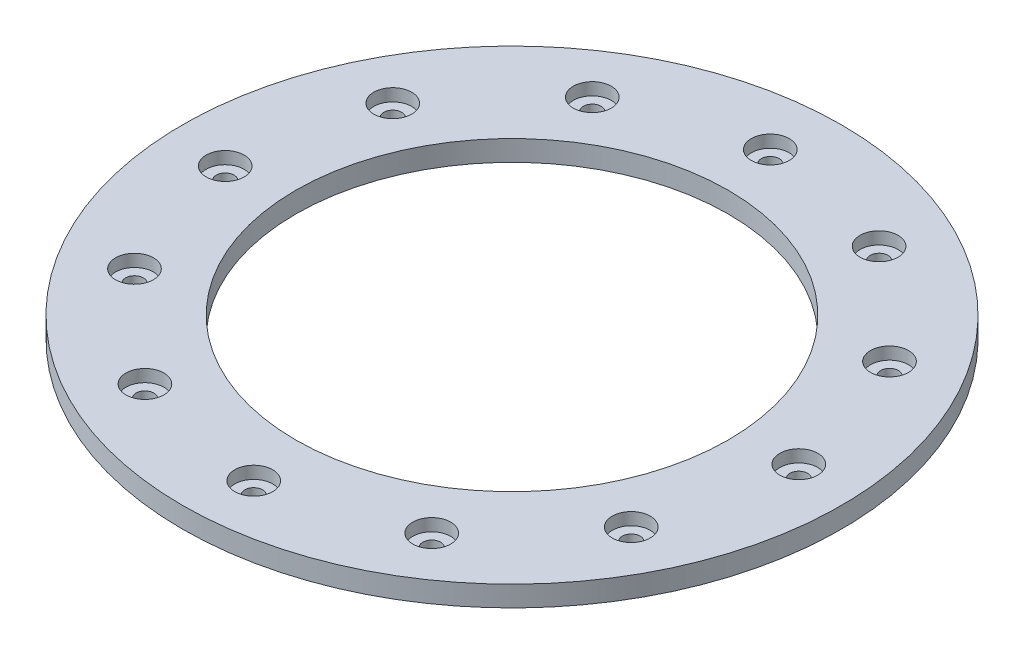
ISO-10303-21;
HEADER;
FILE_DESCRIPTION(('STEP AP214'),'2;1');
FILE_NAME('part.step','',(''),(''),'','','');
FILE_SCHEMA(('AUTOMOTIVE_DESIGN { 1 0 10303 214 1 1 1 1 }'));
ENDSEC;
DATA;
#1=APPLICATION_CONTEXT('core data for automotive mechanical design processes');
#2=APPLICATION_PROTOCOL_DEFINITION('international standard','automotive_design',2000,#1);
#3=PRODUCT_CONTEXT('',#1,'mechanical');
#4=PRODUCT('Part','Part','',(#3));
#5=PRODUCT_RELATED_PRODUCT_CATEGORY('part','',(#4));
#6=PRODUCT_DEFINITION_FORMATION('','',#4);
#7=PRODUCT_DEFINITION_CONTEXT('part definition',#1,'design');
#8=PRODUCT_DEFINITION('design','',#6,#7);
#9=PRODUCT_DEFINITION_SHAPE('','',#8);
#10=(LENGTH_UNIT() NAMED_UNIT(*) SI_UNIT(.MILLI.,.METRE.));
#11=(NAMED_UNIT(*) PLANE_ANGLE_UNIT() SI_UNIT($,.RADIAN.));
#12=(NAMED_UNIT(*) SI_UNIT($,.STERADIAN.) SOLID_ANGLE_UNIT());
#13=UNCERTAINTY_MEASURE_WITH_UNIT(LENGTH_MEASURE(1.E-05),#10,'distance_accuracy_value','');
#14=(GEOMETRIC_REPRESENTATION_CONTEXT(3) GLOBAL_UNCERTAINTY_ASSIGNED_CONTEXT((#13)) GLOBAL_UNIT_ASSIGNED_CONTEXT((#10,
#11,#12)) REPRESENTATION_CONTEXT('',''));
#15=CARTESIAN_POINT('',(0.,0.,0.));
#16=DIRECTION('',(0.,0.,1.));
#17=DIRECTION('',(1.,0.,0.));
#18=AXIS2_PLACEMENT_3D('',#15,#16,#17);
#19=CARTESIAN_POINT('',(0.,6.35,0.));
#20=DIRECTION('',(0.,1.,0.));
#21=DIRECTION('',(0.,0.,1.));
#22=AXIS2_PLACEMENT_3D('',#19,#20,#21);
#23=PLANE('',#22);
#24=CARTESIAN_POINT('',(-45.8207224881937,6.35,-70.5661412924777));
#25=DIRECTION('',(0.,1.,0.));
#26=DIRECTION('',(0.,0.,1.));
#27=AXIS2_PLACEMENT_3D('',#24,#25,#26);
#28=CIRCLE('',#27,5.855);
#29=CARTESIAN_POINT('',(-45.8207224881937,6.35,-64.7111412924777));
#30=VERTEX_POINT('',#29);
#31=EDGE_CURVE('E189',#30,#30,#28,.T.);
#32=ORIENTED_EDGE('',*,*,#31,.F.);
#33=EDGE_LOOP('',(#32));
#34=FACE_BOUND('',#33,.T.);
#35=CARTESIAN_POINT('',(-4.39883904829373,6.35,-84.0224322504247));
#36=DIRECTION('',(0.,1.,0.));
#37=DIRECTION('',(0.,0.,1.));
#38=AXIS2_PLACEMENT_3D('',#35,#36,#37);
#39=CIRCLE('',#38,5.855);
#40=CARTESIAN_POINT('',(-4.39883904829373,6.35,-78.1674322504247));
#41=VERTEX_POINT('',#40);
#42=EDGE_CURVE('E177',#41,#41,#39,.T.);
#43=ORIENTED_EDGE('',*,*,#42,.F.);
#44=EDGE_LOOP('',(#43));
#45=FACE_BOUND('',#44,.T.);
#46=CARTESIAN_POINT('',(38.2017097622311,6.35,-74.9649803407715));
#47=DIRECTION('',(0.,1.,0.));
#48=DIRECTION('',(0.,0.,1.));
#49=AXIS2_PLACEMENT_3D('',#46,#47,#48);
#50=CIRCLE('',#49,5.85499999999999);
#51=CARTESIAN_POINT('',(38.2017097622311,6.35,-69.1099803407715));
#52=VERTEX_POINT('',#51);
#53=EDGE_CURVE('E165',#52,#52,#50,.T.);
#54=ORIENTED_EDGE('',*,*,#53,.F.);
#55=EDGE_LOOP('',(#54));
#56=FACE_BOUND('',#55,.T.);
#57=CARTESIAN_POINT('',(70.5661412924779,6.35,-45.8207224881935));
#58=DIRECTION('',(0.,1.,0.));
#59=DIRECTION('',(0.,0.,1.));
#60=AXIS2_PLACEMENT_3D('',#57,#58,#59);
#61=CIRCLE('',#60,5.855);
#62=CARTESIAN_POINT('',(70.5661412924779,6.35,-39.9657224881935));
#63=VERTEX_POINT('',#62);
#64=EDGE_CURVE('E153',#63,#63,#61,.T.);
#65=ORIENTED_EDGE('',*,*,#64,.F.);
#66=EDGE_LOOP('',(#65));
#67=FACE_BOUND('',#66,.T.);
#68=CARTESIAN_POINT('',(84.0224322504247,6.35,-4.39883904829343));
#69=DIRECTION('',(0.,1.,0.));
#70=DIRECTION('',(0.,0.,1.));
#71=AXIS2_PLACEMENT_3D('',#68,#69,#70);
#72=CIRCLE('',#71,5.855);
#73=CARTESIAN_POINT('',(84.0224322504247,6.35,1.45616095170657));
#74=VERTEX_POINT('',#73);
#75=EDGE_CURVE('E141',#74,#74,#72,.T.);
#76=ORIENTED_EDGE('',*,*,#75,.F.);
#77=EDGE_LOOP('',(#76));
#78=FACE_BOUND('',#77,.T.);
#79=CARTESIAN_POINT('',(74.9649803407711,6.35,38.2017097622319));
#80=DIRECTION('',(0.,1.,0.));
#81=DIRECTION('',(0.,0.,1.));
#82=AXIS2_PLACEMENT_3D('',#79,#80,#81);
#83=CIRCLE('',#82,5.855);
#84=CARTESIAN_POINT('',(74.9649803407711,6.35,44.0567097622319));
#85=VERTEX_POINT('',#84);
#86=EDGE_CURVE('E129',#85,#85,#83,.T.);
#87=ORIENTED_EDGE('',*,*,#86,.F.);
#88=EDGE_LOOP('',(#87));
#89=FACE_BOUND('',#88,.T.);
#90=CARTESIAN_POINT('',(45.8207224881932,6.35,70.5661412924781));
#91=DIRECTION('',(0.,1.,0.));
#92=DIRECTION('',(0.,0.,1.));
#93=AXIS2_PLACEMENT_3D('',#90,#91,#92);
#94=CIRCLE('',#93,5.85499999999999);
#95=CARTESIAN_POINT('',(45.8207224881932,6.35,76.4211412924781));
#96=VERTEX_POINT('',#95);
#97=EDGE_CURVE('E117',#96,#96,#94,.T.);
#98=ORIENTED_EDGE('',*,*,#97,.F.);
#99=EDGE_LOOP('',(#98));
#100=FACE_BOUND('',#99,.T.);
#101=CARTESIAN_POINT('',(4.39883904829314,6.35,84.0224322504247));
#102=DIRECTION('',(0.,1.,0.));
#103=DIRECTION('',(0.,0.,1.));
#104=AXIS2_PLACEMENT_3D('',#101,#102,#103);
#105=CIRCLE('',#104,5.855);
#106=CARTESIAN_POINT('',(4.39883904829314,6.35,89.8774322504247));
#107=VERTEX_POINT('',#106);
#108=EDGE_CURVE('E105',#107,#107,#105,.T.);
#109=ORIENTED_EDGE('',*,*,#108,.F.);
#110=EDGE_LOOP('',(#109));
#111=FACE_BOUND('',#110,.T.);
#112=CARTESIAN_POINT('',(-38.2017097622316,6.35,74.9649803407712));
#113=DIRECTION('',(0.,1.,0.));
#114=DIRECTION('',(0.,0.,1.));
#115=AXIS2_PLACEMENT_3D('',#112,#113,#114);
#116=CIRCLE('',#115,5.855);
#117=CARTESIAN_POINT('',(-38.2017097622316,6.35,80.8199803407712));
#118=VERTEX_POINT('',#117);
#119=EDGE_CURVE('E93',#118,#118,#116,.T.);
#120=ORIENTED_EDGE('',*,*,#119,.F.);
#121=EDGE_LOOP('',(#120));
#122=FACE_BOUND('',#121,.T.);
#123=CARTESIAN_POINT('',(-70.5661412924782,6.35,45.820722488193));
#124=DIRECTION('',(0.,1.,0.));
#125=DIRECTION('',(0.,0.,1.));
#126=AXIS2_PLACEMENT_3D('',#123,#124,#125);
#127=CIRCLE('',#126,5.855);
#128=CARTESIAN_POINT('',(-70.5661412924782,6.35,51.675722488193));
#129=VERTEX_POINT('',#128);
#130=EDGE_CURVE('E81',#129,#129,#127,.T.);
#131=ORIENTED_EDGE('',*,*,#130,.F.);
#132=EDGE_LOOP('',(#131));
#133=FACE_BOUND('',#132,.T.);
#134=CARTESIAN_POINT('',(-84.0224322504247,6.35,4.39883904829285));
#135=DIRECTION('',(0.,1.,0.));
#136=DIRECTION('',(0.,0.,1.));
#137=AXIS2_PLACEMENT_3D('',#134,#135,#136);
#138=CIRCLE('',#137,5.855);
#139=CARTESIAN_POINT('',(-84.0224322504247,6.35,10.2538390482928));
#140=VERTEX_POINT('',#139);
#141=EDGE_CURVE('E69',#140,#140,#138,.T.);
#142=ORIENTED_EDGE('',*,*,#141,.F.);
#143=EDGE_LOOP('',(#142));
#144=FACE_BOUND('',#143,.T.);
#145=CARTESIAN_POINT('',(-74.9649803407711,6.35,-38.2017097622319));
#146=DIRECTION('',(0.,1.,0.));
#147=DIRECTION('',(0.,0.,1.));
#148=AXIS2_PLACEMENT_3D('',#145,#146,#147);
#149=CIRCLE('',#148,5.855);
#150=CARTESIAN_POINT('',(-74.9649803407711,6.35,-32.3467097622319));
#151=VERTEX_POINT('',#150);
#152=EDGE_CURVE('E57',#151,#151,#149,.T.);
#153=ORIENTED_EDGE('',*,*,#152,.F.);
#154=EDGE_LOOP('',(#153));
#155=FACE_BOUND('',#154,.T.);
#156=CARTESIAN_POINT('',(0.,6.35,0.));
#157=DIRECTION('',(0.,1.,0.));
#158=DIRECTION('',(0.,0.,1.));
#159=AXIS2_PLACEMENT_3D('',#156,#157,#158);
#160=CIRCLE('',#159,66.675);
#161=CARTESIAN_POINT('',(0.,6.35,66.675));
#162=VERTEX_POINT('',#161);
#163=EDGE_CURVE('E41',#162,#162,#160,.T.);
#164=ORIENTED_EDGE('',*,*,#163,.F.);
#165=EDGE_LOOP('',(#164));
#166=FACE_BOUND('',#165,.T.);
#167=CARTESIAN_POINT('',(0.,6.35,0.));
#168=DIRECTION('',(0.,1.,0.));
#169=DIRECTION('',(0.,0.,1.));
#170=AXIS2_PLACEMENT_3D('',#167,#168,#169);
#171=CIRCLE('',#170,101.6);
#172=CARTESIAN_POINT('',(0.,6.35,101.6));
#173=VERTEX_POINT('',#172);
#174=EDGE_CURVE('E10',#173,#173,#171,.T.);
#175=ORIENTED_EDGE('',*,*,#174,.T.);
#176=EDGE_LOOP('',(#175));
#177=FACE_BOUND('',#176,.T.);
#178=ADVANCED_FACE('F30',(#34,#45,#56,#67,#78,#89,#100,#111,#122,#133,#144,#155,#166,#177),#23,.T.);
#179=CARTESIAN_POINT('',(0.,0.,0.));
#180=DIRECTION('',(0.,1.,0.));
#181=DIRECTION('',(0.,0.,1.));
#182=AXIS2_PLACEMENT_3D('',#179,#180,#181);
#183=PLANE('',#182);
#184=CARTESIAN_POINT('',(-45.8207224881937,0.,-70.5661412924777));
#185=DIRECTION('',(0.,1.,0.));
#186=DIRECTION('',(0.,0.,1.));
#187=AXIS2_PLACEMENT_3D('',#184,#185,#186);
#188=CIRCLE('',#187,2.75);
#189=CARTESIAN_POINT('',(-45.8207224881937,0.,-67.8161412924777));
#190=VERTEX_POINT('',#189);
#191=EDGE_CURVE('E180',#190,#190,#188,.T.);
#192=ORIENTED_EDGE('',*,*,#191,.T.);
#193=EDGE_LOOP('',(#192));
#194=FACE_BOUND('',#193,.T.);
#195=CARTESIAN_POINT('',(-4.39883904829373,0.,-84.0224322504247));
#196=DIRECTION('',(0.,1.,0.));
#197=DIRECTION('',(0.,0.,1.));
#198=AXIS2_PLACEMENT_3D('',#195,#196,#197);
#199=CIRCLE('',#198,2.75);
#200=CARTESIAN_POINT('',(-4.39883904829373,0.,-81.2724322504247));
#201=VERTEX_POINT('',#200);
#202=EDGE_CURVE('E168',#201,#201,#199,.T.);
#203=ORIENTED_EDGE('',*,*,#202,.T.);
#204=EDGE_LOOP('',(#203));
#205=FACE_BOUND('',#204,.T.);
#206=CARTESIAN_POINT('',(38.2017097622311,0.,-74.9649803407715));
#207=DIRECTION('',(0.,1.,0.));
#208=DIRECTION('',(0.,0.,1.));
#209=AXIS2_PLACEMENT_3D('',#206,#207,#208);
#210=CIRCLE('',#209,2.75);
#211=CARTESIAN_POINT('',(38.2017097622311,0.,-72.2149803407715));
#212=VERTEX_POINT('',#211);
#213=EDGE_CURVE('E156',#212,#212,#210,.T.);
#214=ORIENTED_EDGE('',*,*,#213,.T.);
#215=EDGE_LOOP('',(#214));
#216=FACE_BOUND('',#215,.T.);
#217=CARTESIAN_POINT('',(70.5661412924779,0.,-45.8207224881935));
#218=DIRECTION('',(0.,1.,0.));
#219=DIRECTION('',(0.,0.,1.));
#220=AXIS2_PLACEMENT_3D('',#217,#218,#219);
#221=CIRCLE('',#220,2.75);
#222=CARTESIAN_POINT('',(70.5661412924779,0.,-43.0707224881935));
#223=VERTEX_POINT('',#222);
#224=EDGE_CURVE('E144',#223,#223,#221,.T.);
#225=ORIENTED_EDGE('',*,*,#224,.T.);
#226=EDGE_LOOP('',(#225));
#227=FACE_BOUND('',#226,.T.);
#228=CARTESIAN_POINT('',(84.0224322504247,0.,-4.39883904829343));
#229=DIRECTION('',(0.,1.,0.));
#230=DIRECTION('',(0.,0.,1.));
#231=AXIS2_PLACEMENT_3D('',#228,#229,#230);
#232=CIRCLE('',#231,2.75);
#233=CARTESIAN_POINT('',(84.0224322504247,0.,-1.64883904829343));
#234=VERTEX_POINT('',#233);
#235=EDGE_CURVE('E132',#234,#234,#232,.T.);
#236=ORIENTED_EDGE('',*,*,#235,.T.);
#237=EDGE_LOOP('',(#236));
#238=FACE_BOUND('',#237,.T.);
#239=CARTESIAN_POINT('',(74.9649803407711,0.,38.2017097622319));
#240=DIRECTION('',(0.,1.,0.));
#241=DIRECTION('',(0.,0.,1.));
#242=AXIS2_PLACEMENT_3D('',#239,#240,#241);
#243=CIRCLE('',#242,2.75);
#244=CARTESIAN_POINT('',(74.9649803407711,0.,40.9517097622319));
#245=VERTEX_POINT('',#244);
#246=EDGE_CURVE('E120',#245,#245,#243,.T.);
#247=ORIENTED_EDGE('',*,*,#246,.T.);
#248=EDGE_LOOP('',(#247));
#249=FACE_BOUND('',#248,.T.);
#250=CARTESIAN_POINT('',(45.8207224881932,0.,70.5661412924781));
#251=DIRECTION('',(0.,1.,0.));
#252=DIRECTION('',(0.,0.,1.));
#253=AXIS2_PLACEMENT_3D('',#250,#251,#252);
#254=CIRCLE('',#253,2.75);
#255=CARTESIAN_POINT('',(45.8207224881932,0.,73.3161412924781));
#256=VERTEX_POINT('',#255);
#257=EDGE_CURVE('E108',#256,#256,#254,.T.);
#258=ORIENTED_EDGE('',*,*,#257,.T.);
#259=EDGE_LOOP('',(#258));
#260=FACE_BOUND('',#259,.T.);
#261=CARTESIAN_POINT('',(4.39883904829314,0.,84.0224322504247));
#262=DIRECTION('',(0.,1.,0.));
#263=DIRECTION('',(0.,0.,1.));
#264=AXIS2_PLACEMENT_3D('',#261,#262,#263);
#265=CIRCLE('',#264,2.75);
#266=CARTESIAN_POINT('',(4.39883904829314,0.,86.7724322504247));
#267=VERTEX_POINT('',#266);
#268=EDGE_CURVE('E96',#267,#267,#265,.T.);
#269=ORIENTED_EDGE('',*,*,#268,.T.);
#270=EDGE_LOOP('',(#269));
#271=FACE_BOUND('',#270,.T.);
#272=CARTESIAN_POINT('',(-38.2017097622316,0.,74.9649803407712));
#273=DIRECTION('',(0.,1.,0.));
#274=DIRECTION('',(0.,0.,1.));
#275=AXIS2_PLACEMENT_3D('',#272,#273,#274);
#276=CIRCLE('',#275,2.75);
#277=CARTESIAN_POINT('',(-38.2017097622316,0.,77.7149803407712));
#278=VERTEX_POINT('',#277);
#279=EDGE_CURVE('E84',#278,#278,#276,.T.);
#280=ORIENTED_EDGE('',*,*,#279,.T.);
#281=EDGE_LOOP('',(#280));
#282=FACE_BOUND('',#281,.T.);
#283=CARTESIAN_POINT('',(-70.5661412924782,0.,45.820722488193));
#284=DIRECTION('',(0.,1.,0.));
#285=DIRECTION('',(0.,0.,1.));
#286=AXIS2_PLACEMENT_3D('',#283,#284,#285);
#287=CIRCLE('',#286,2.75);
#288=CARTESIAN_POINT('',(-70.5661412924782,0.,48.570722488193));
#289=VERTEX_POINT('',#288);
#290=EDGE_CURVE('E72',#289,#289,#287,.T.);
#291=ORIENTED_EDGE('',*,*,#290,.T.);
#292=EDGE_LOOP('',(#291));
#293=FACE_BOUND('',#292,.T.);
#294=CARTESIAN_POINT('',(-84.0224322504247,0.,4.39883904829285));
#295=DIRECTION('',(0.,1.,0.));
#296=DIRECTION('',(0.,0.,1.));
#297=AXIS2_PLACEMENT_3D('',#294,#295,#296);
#298=CIRCLE('',#297,2.75);
#299=CARTESIAN_POINT('',(-84.0224322504247,0.,7.14883904829285));
#300=VERTEX_POINT('',#299);
#301=EDGE_CURVE('E60',#300,#300,#298,.T.);
#302=ORIENTED_EDGE('',*,*,#301,.T.);
#303=EDGE_LOOP('',(#302));
#304=FACE_BOUND('',#303,.T.);
#305=CARTESIAN_POINT('',(-74.9649803407711,0.,-38.2017097622319));
#306=DIRECTION('',(0.,1.,0.));
#307=DIRECTION('',(0.,0.,1.));
#308=AXIS2_PLACEMENT_3D('',#305,#306,#307);
#309=CIRCLE('',#308,2.75);
#310=CARTESIAN_POINT('',(-74.9649803407711,0.,-35.4517097622319));
#311=VERTEX_POINT('',#310);
#312=EDGE_CURVE('E46',#311,#311,#309,.T.);
#313=ORIENTED_EDGE('',*,*,#312,.T.);
#314=EDGE_LOOP('',(#313));
#315=FACE_BOUND('',#314,.T.);
#316=CARTESIAN_POINT('',(0.,0.,0.));
#317=DIRECTION('',(0.,1.,0.));
#318=DIRECTION('',(0.,0.,1.));
#319=AXIS2_PLACEMENT_3D('',#316,#317,#318);
#320=CIRCLE('',#319,101.6);
#321=CARTESIAN_POINT('',(0.,0.,101.6));
#322=VERTEX_POINT('',#321);
#323=EDGE_CURVE('E34',#322,#322,#320,.T.);
#324=ORIENTED_EDGE('',*,*,#323,.F.);
#325=EDGE_LOOP('',(#324));
#326=FACE_BOUND('',#325,.T.);
#327=CARTESIAN_POINT('',(0.,0.,0.));
#328=DIRECTION('',(0.,1.,0.));
#329=DIRECTION('',(0.,0.,1.));
#330=AXIS2_PLACEMENT_3D('',#327,#328,#329);
#331=CIRCLE('',#330,66.675);
#332=CARTESIAN_POINT('',(0.,0.,66.675));
#333=VERTEX_POINT('',#332);
#334=EDGE_CURVE('E43',#333,#333,#331,.T.);
#335=ORIENTED_EDGE('',*,*,#334,.T.);
#336=EDGE_LOOP('',(#335));
#337=FACE_BOUND('',#336,.T.);
#338=ADVANCED_FACE('F197',(#194,#205,#216,#227,#238,#249,#260,#271,#282,#293,#304,#315,#326,
#337),#183,.F.);
#339=CARTESIAN_POINT('',(0.,6.35,0.));
#340=DIRECTION('',(0.,-1.,0.));
#341=DIRECTION('',(0.,0.,-1.));
#342=AXIS2_PLACEMENT_3D('',#339,#340,#341);
#343=CYLINDRICAL_SURFACE('',#342,101.6);
#344=ORIENTED_EDGE('',*,*,#174,.F.);
#345=EDGE_LOOP('',(#344));
#346=FACE_BOUND('',#345,.T.);
#347=ORIENTED_EDGE('',*,*,#323,.T.);
#348=EDGE_LOOP('',(#347));
#349=FACE_BOUND('',#348,.T.);
#350=ADVANCED_FACE('F32',(#346,#349),#343,.T.);
#351=CARTESIAN_POINT('',(0.,6.35,0.));
#352=DIRECTION('',(0.,-1.,0.));
#353=DIRECTION('',(0.,0.,-1.));
#354=AXIS2_PLACEMENT_3D('',#351,#352,#353);
#355=CYLINDRICAL_SURFACE('',#354,66.675);
#356=ORIENTED_EDGE('',*,*,#163,.T.);
#357=EDGE_LOOP('',(#356));
#358=FACE_BOUND('',#357,.T.);
#359=ORIENTED_EDGE('',*,*,#334,.F.);
#360=EDGE_LOOP('',(#359));
#361=FACE_BOUND('',#360,.T.);
#362=ADVANCED_FACE('F223',(#358,#361),#355,.F.);
#363=CARTESIAN_POINT('',(-74.9649803407711,6.35,-38.2017097622319));
#364=DIRECTION('',(0.,1.,0.));
#365=DIRECTION('',(0.,0.,1.));
#366=AXIS2_PLACEMENT_3D('',#363,#364,#365);
#367=CYLINDRICAL_SURFACE('',#366,2.75);
#368=ORIENTED_EDGE('',*,*,#312,.F.);
#369=EDGE_LOOP('',(#368));
#370=FACE_BOUND('',#369,.T.);
#371=CARTESIAN_POINT('',(-74.9649803407711,2.55,-38.2017097622319));
#372=DIRECTION('',(0.,1.,0.));
#373=DIRECTION('',(0.,0.,1.));
#374=AXIS2_PLACEMENT_3D('',#371,#372,#373);
#375=CIRCLE('',#374,2.75);
#376=CARTESIAN_POINT('',(-74.9649803407711,2.55,-35.4517097622319));
#377=VERTEX_POINT('',#376);
#378=EDGE_CURVE('E51',#377,#377,#375,.T.);
#379=ORIENTED_EDGE('',*,*,#378,.T.);
#380=EDGE_LOOP('',(#379));
#381=FACE_BOUND('',#380,.T.);
#382=ADVANCED_FACE('F226',(#370,#381),#367,.F.);
#383=CARTESIAN_POINT('',(-72.2149803407711,2.55,-38.2017097622319));
#384=DIRECTION('',(0.,-1.,0.));
#385=DIRECTION('',(0.,0.,-1.));
#386=AXIS2_PLACEMENT_3D('',#383,#384,#385);
#387=PLANE('',#386);
#388=ORIENTED_EDGE('',*,*,#378,.F.);
#389=EDGE_LOOP('',(#388));
#390=FACE_BOUND('',#389,.T.);
#391=CARTESIAN_POINT('',(-74.9649803407711,2.55,-38.2017097622319));
#392=DIRECTION('',(0.,1.,0.));
#393=DIRECTION('',(0.,0.,1.));
#394=AXIS2_PLACEMENT_3D('',#391,#392,#393);
#395=CIRCLE('',#394,5.855);
#396=CARTESIAN_POINT('',(-74.9649803407711,2.55,-32.3467097622319));
#397=VERTEX_POINT('',#396);
#398=EDGE_CURVE('E54',#397,#397,#395,.T.);
#399=ORIENTED_EDGE('',*,*,#398,.T.);
#400=EDGE_LOOP('',(#399));
#401=FACE_BOUND('',#400,.T.);
#402=ADVANCED_FACE('F240',(#390,#401),#387,.F.);
#403=CARTESIAN_POINT('',(-74.9649803407711,6.35,-38.2017097622319));
#404=DIRECTION('',(0.,1.,0.));
#405=DIRECTION('',(0.,0.,1.));
#406=AXIS2_PLACEMENT_3D('',#403,#404,#405);
#407=CYLINDRICAL_SURFACE('',#406,5.855);
#408=ORIENTED_EDGE('',*,*,#398,.F.);
#409=EDGE_LOOP('',(#408));
#410=FACE_BOUND('',#409,.T.);
#411=ORIENTED_EDGE('',*,*,#152,.T.);
#412=EDGE_LOOP('',(#411));
#413=FACE_BOUND('',#412,.T.);
#414=ADVANCED_FACE('F244',(#410,#413),#407,.F.);
#415=CARTESIAN_POINT('',(-84.0224322504247,6.35,4.39883904829285));
#416=DIRECTION('',(0.,1.,0.));
#417=DIRECTION('',(0.,0.,1.));
#418=AXIS2_PLACEMENT_3D('',#415,#416,#417);
#419=CYLINDRICAL_SURFACE('',#418,2.75);
#420=ORIENTED_EDGE('',*,*,#301,.F.);
#421=EDGE_LOOP('',(#420));
#422=FACE_BOUND('',#421,.T.);
#423=CARTESIAN_POINT('',(-84.0224322504247,2.55,4.39883904829285));
#424=DIRECTION('',(0.,1.,0.));
#425=DIRECTION('',(0.,0.,1.));
#426=AXIS2_PLACEMENT_3D('',#423,#424,#425);
#427=CIRCLE('',#426,2.75);
#428=CARTESIAN_POINT('',(-84.0224322504247,2.55,7.14883904829285));
#429=VERTEX_POINT('',#428);
#430=EDGE_CURVE('E63',#429,#429,#427,.T.);
#431=ORIENTED_EDGE('',*,*,#430,.T.);
#432=EDGE_LOOP('',(#431));
#433=FACE_BOUND('',#432,.T.);
#434=ADVANCED_FACE('F248',(#422,#433),#419,.F.);
#435=CARTESIAN_POINT('',(-81.2724322504247,2.55,4.39883904829285));
#436=DIRECTION('',(0.,-1.,0.));
#437=DIRECTION('',(0.,0.,-1.));
#438=AXIS2_PLACEMENT_3D('',#435,#436,#437);
#439=PLANE('',#438);
#440=ORIENTED_EDGE('',*,*,#430,.F.);
#441=EDGE_LOOP('',(#440));
#442=FACE_BOUND('',#441,.T.);
#443=CARTESIAN_POINT('',(-84.0224322504247,2.55,4.39883904829285));
#444=DIRECTION('',(0.,1.,0.));
#445=DIRECTION('',(0.,0.,1.));
#446=AXIS2_PLACEMENT_3D('',#443,#444,#445);
#447=CIRCLE('',#446,5.855);
#448=CARTESIAN_POINT('',(-84.0224322504247,2.55,10.2538390482928));
#449=VERTEX_POINT('',#448);
#450=EDGE_CURVE('E66',#449,#449,#447,.T.);
#451=ORIENTED_EDGE('',*,*,#450,.T.);
#452=EDGE_LOOP('',(#451));
#453=FACE_BOUND('',#452,.T.);
#454=ADVANCED_FACE('F252',(#442,#453),#439,.F.);
#455=CARTESIAN_POINT('',(-84.0224322504247,6.35,4.39883904829285));
#456=DIRECTION('',(0.,1.,0.));
#457=DIRECTION('',(0.,0.,1.));
#458=AXIS2_PLACEMENT_3D('',#455,#456,#457);
#459=CYLINDRICAL_SURFACE('',#458,5.855);
#460=ORIENTED_EDGE('',*,*,#450,.F.);
#461=EDGE_LOOP('',(#460));
#462=FACE_BOUND('',#461,.T.);
#463=ORIENTED_EDGE('',*,*,#141,.T.);
#464=EDGE_LOOP('',(#463));
#465=FACE_BOUND('',#464,.T.);
#466=ADVANCED_FACE('F256',(#462,#465),#459,.F.);
#467=CARTESIAN_POINT('',(-70.5661412924782,6.35,45.820722488193));
#468=DIRECTION('',(0.,1.,0.));
#469=DIRECTION('',(0.,0.,1.));
#470=AXIS2_PLACEMENT_3D('',#467,#468,#469);
#471=CYLINDRICAL_SURFACE('',#470,2.75);
#472=ORIENTED_EDGE('',*,*,#290,.F.);
#473=EDGE_LOOP('',(#472));
#474=FACE_BOUND('',#473,.T.);
#475=CARTESIAN_POINT('',(-70.5661412924782,2.55,45.820722488193));
#476=DIRECTION('',(0.,1.,0.));
#477=DIRECTION('',(0.,0.,1.));
#478=AXIS2_PLACEMENT_3D('',#475,#476,#477);
#479=CIRCLE('',#478,2.75);
#480=CARTESIAN_POINT('',(-70.5661412924782,2.55,48.570722488193));
#481=VERTEX_POINT('',#480);
#482=EDGE_CURVE('E75',#481,#481,#479,.T.);
#483=ORIENTED_EDGE('',*,*,#482,.T.);
#484=EDGE_LOOP('',(#483));
#485=FACE_BOUND('',#484,.T.);
#486=ADVANCED_FACE('F260',(#474,#485),#471,.F.);
#487=CARTESIAN_POINT('',(-67.8161412924782,2.55,45.820722488193));
#488=DIRECTION('',(0.,-1.,0.));
#489=DIRECTION('',(0.,0.,-1.));
#490=AXIS2_PLACEMENT_3D('',#487,#488,#489);
#491=PLANE('',#490);
#492=ORIENTED_EDGE('',*,*,#482,.F.);
#493=EDGE_LOOP('',(#492));
#494=FACE_BOUND('',#493,.T.);
#495=CARTESIAN_POINT('',(-70.5661412924782,2.55,45.820722488193));
#496=DIRECTION('',(0.,1.,0.));
#497=DIRECTION('',(0.,0.,1.));
#498=AXIS2_PLACEMENT_3D('',#495,#496,#497);
#499=CIRCLE('',#498,5.855);
#500=CARTESIAN_POINT('',(-70.5661412924782,2.55,51.675722488193));
#501=VERTEX_POINT('',#500);
#502=EDGE_CURVE('E78',#501,#501,#499,.T.);
#503=ORIENTED_EDGE('',*,*,#502,.T.);
#504=EDGE_LOOP('',(#503));
#505=FACE_BOUND('',#504,.T.);
#506=ADVANCED_FACE('F264',(#494,#505),#491,.F.);
#507=CARTESIAN_POINT('',(-70.5661412924782,6.35,45.820722488193));
#508=DIRECTION('',(0.,1.,0.));
#509=DIRECTION('',(0.,0.,1.));
#510=AXIS2_PLACEMENT_3D('',#507,#508,#509);
#511=CYLINDRICAL_SURFACE('',#510,5.855);
#512=ORIENTED_EDGE('',*,*,#502,.F.);
#513=EDGE_LOOP('',(#512));
#514=FACE_BOUND('',#513,.T.);
#515=ORIENTED_EDGE('',*,*,#130,.T.);
#516=EDGE_LOOP('',(#515));
#517=FACE_BOUND('',#516,.T.);
#518=ADVANCED_FACE('F268',(#514,#517),#511,.F.);
#519=CARTESIAN_POINT('',(-38.2017097622316,6.35,74.9649803407712));
#520=DIRECTION('',(0.,1.,0.));
#521=DIRECTION('',(0.,0.,1.));
#522=AXIS2_PLACEMENT_3D('',#519,#520,#521);
#523=CYLINDRICAL_SURFACE('',#522,2.75);
#524=ORIENTED_EDGE('',*,*,#279,.F.);
#525=EDGE_LOOP('',(#524));
#526=FACE_BOUND('',#525,.T.);
#527=CARTESIAN_POINT('',(-38.2017097622316,2.55,74.9649803407712));
#528=DIRECTION('',(0.,1.,0.));
#529=DIRECTION('',(0.,0.,1.));
#530=AXIS2_PLACEMENT_3D('',#527,#528,#529);
#531=CIRCLE('',#530,2.75);
#532=CARTESIAN_POINT('',(-38.2017097622316,2.55,77.7149803407712));
#533=VERTEX_POINT('',#532);
#534=EDGE_CURVE('E87',#533,#533,#531,.T.);
#535=ORIENTED_EDGE('',*,*,#534,.T.);
#536=EDGE_LOOP('',(#535));
#537=FACE_BOUND('',#536,.T.);
#538=ADVANCED_FACE('F272',(#526,#537),#523,.F.);
#539=CARTESIAN_POINT('',(-35.4517097622316,2.55,74.9649803407712));
#540=DIRECTION('',(0.,-1.,0.));
#541=DIRECTION('',(0.,0.,-1.));
#542=AXIS2_PLACEMENT_3D('',#539,#540,#541);
#543=PLANE('',#542);
#544=ORIENTED_EDGE('',*,*,#534,.F.);
#545=EDGE_LOOP('',(#544));
#546=FACE_BOUND('',#545,.T.);
#547=CARTESIAN_POINT('',(-38.2017097622316,2.55,74.9649803407712));
#548=DIRECTION('',(0.,1.,0.));
#549=DIRECTION('',(0.,0.,1.));
#550=AXIS2_PLACEMENT_3D('',#547,#548,#549);
#551=CIRCLE('',#550,5.855);
#552=CARTESIAN_POINT('',(-38.2017097622316,2.55,80.8199803407712));
#553=VERTEX_POINT('',#552);
#554=EDGE_CURVE('E90',#553,#553,#551,.T.);
#555=ORIENTED_EDGE('',*,*,#554,.T.);
#556=EDGE_LOOP('',(#555));
#557=FACE_BOUND('',#556,.T.);
#558=ADVANCED_FACE('F276',(#546,#557),#543,.F.);
#559=CARTESIAN_POINT('',(-38.2017097622316,6.35,74.9649803407712));
#560=DIRECTION('',(0.,1.,0.));
#561=DIRECTION('',(0.,0.,1.));
#562=AXIS2_PLACEMENT_3D('',#559,#560,#561);
#563=CYLINDRICAL_SURFACE('',#562,5.855);
#564=ORIENTED_EDGE('',*,*,#554,.F.);
#565=EDGE_LOOP('',(#564));
#566=FACE_BOUND('',#565,.T.);
#567=ORIENTED_EDGE('',*,*,#119,.T.);
#568=EDGE_LOOP('',(#567));
#569=FACE_BOUND('',#568,.T.);
#570=ADVANCED_FACE('F280',(#566,#569),#563,.F.);
#571=CARTESIAN_POINT('',(4.39883904829314,6.35,84.0224322504247));
#572=DIRECTION('',(0.,1.,0.));
#573=DIRECTION('',(0.,0.,1.));
#574=AXIS2_PLACEMENT_3D('',#571,#572,#573);
#575=CYLINDRICAL_SURFACE('',#574,2.75);
#576=ORIENTED_EDGE('',*,*,#268,.F.);
#577=EDGE_LOOP('',(#576));
#578=FACE_BOUND('',#577,.T.);
#579=CARTESIAN_POINT('',(4.39883904829314,2.55,84.0224322504247));
#580=DIRECTION('',(0.,1.,0.));
#581=DIRECTION('',(0.,0.,1.));
#582=AXIS2_PLACEMENT_3D('',#579,#580,#581);
#583=CIRCLE('',#582,2.75);
#584=CARTESIAN_POINT('',(4.39883904829314,2.55,86.7724322504247));
#585=VERTEX_POINT('',#584);
#586=EDGE_CURVE('E99',#585,#585,#583,.T.);
#587=ORIENTED_EDGE('',*,*,#586,.T.);
#588=EDGE_LOOP('',(#587));
#589=FACE_BOUND('',#588,.T.);
#590=ADVANCED_FACE('F284',(#578,#589),#575,.F.);
#591=CARTESIAN_POINT('',(7.14883904829313,2.55,84.0224322504247));
#592=DIRECTION('',(0.,-1.,0.));
#593=DIRECTION('',(0.,0.,-1.));
#594=AXIS2_PLACEMENT_3D('',#591,#592,#593);
#595=PLANE('',#594);
#596=ORIENTED_EDGE('',*,*,#586,.F.);
#597=EDGE_LOOP('',(#596));
#598=FACE_BOUND('',#597,.T.);
#599=CARTESIAN_POINT('',(4.39883904829314,2.55,84.0224322504247));
#600=DIRECTION('',(0.,1.,0.));
#601=DIRECTION('',(0.,0.,1.));
#602=AXIS2_PLACEMENT_3D('',#599,#600,#601);
#603=CIRCLE('',#602,5.855);
#604=CARTESIAN_POINT('',(4.39883904829314,2.55,89.8774322504247));
#605=VERTEX_POINT('',#604);
#606=EDGE_CURVE('E102',#605,#605,#603,.T.);
#607=ORIENTED_EDGE('',*,*,#606,.T.);
#608=EDGE_LOOP('',(#607));
#609=FACE_BOUND('',#608,.T.);
#610=ADVANCED_FACE('F288',(#598,#609),#595,.F.);
#611=CARTESIAN_POINT('',(4.39883904829314,6.35,84.0224322504247));
#612=DIRECTION('',(0.,1.,0.));
#613=DIRECTION('',(0.,0.,1.));
#614=AXIS2_PLACEMENT_3D('',#611,#612,#613);
#615=CYLINDRICAL_SURFACE('',#614,5.855);
#616=ORIENTED_EDGE('',*,*,#606,.F.);
#617=EDGE_LOOP('',(#616));
#618=FACE_BOUND('',#617,.T.);
#619=ORIENTED_EDGE('',*,*,#108,.T.);
#620=EDGE_LOOP('',(#619));
#621=FACE_BOUND('',#620,.T.);
#622=ADVANCED_FACE('F292',(#618,#621),#615,.F.);
#623=CARTESIAN_POINT('',(45.8207224881932,6.35,70.5661412924781));
#624=DIRECTION('',(0.,1.,0.));
#625=DIRECTION('',(0.,0.,1.));
#626=AXIS2_PLACEMENT_3D('',#623,#624,#625);
#627=CYLINDRICAL_SURFACE('',#626,2.75);
#628=ORIENTED_EDGE('',*,*,#257,.F.);
#629=EDGE_LOOP('',(#628));
#630=FACE_BOUND('',#629,.T.);
#631=CARTESIAN_POINT('',(45.8207224881932,2.55,70.5661412924781));
#632=DIRECTION('',(0.,1.,0.));
#633=DIRECTION('',(0.,0.,1.));
#634=AXIS2_PLACEMENT_3D('',#631,#632,#633);
#635=CIRCLE('',#634,2.75);
#636=CARTESIAN_POINT('',(45.8207224881932,2.55,73.3161412924781));
#637=VERTEX_POINT('',#636);
#638=EDGE_CURVE('E111',#637,#637,#635,.T.);
#639=ORIENTED_EDGE('',*,*,#638,.T.);
#640=EDGE_LOOP('',(#639));
#641=FACE_BOUND('',#640,.T.);
#642=ADVANCED_FACE('F296',(#630,#641),#627,.F.);
#643=CARTESIAN_POINT('',(48.5707224881932,2.55,70.5661412924781));
#644=DIRECTION('',(0.,-1.,0.));
#645=DIRECTION('',(0.,0.,-1.));
#646=AXIS2_PLACEMENT_3D('',#643,#644,#645);
#647=PLANE('',#646);
#648=ORIENTED_EDGE('',*,*,#638,.F.);
#649=EDGE_LOOP('',(#648));
#650=FACE_BOUND('',#649,.T.);
#651=CARTESIAN_POINT('',(45.8207224881932,2.55,70.5661412924781));
#652=DIRECTION('',(0.,1.,0.));
#653=DIRECTION('',(0.,0.,1.));
#654=AXIS2_PLACEMENT_3D('',#651,#652,#653);
#655=CIRCLE('',#654,5.855);
#656=CARTESIAN_POINT('',(45.8207224881932,2.55,76.4211412924781));
#657=VERTEX_POINT('',#656);
#658=EDGE_CURVE('E114',#657,#657,#655,.T.);
#659=ORIENTED_EDGE('',*,*,#658,.T.);
#660=EDGE_LOOP('',(#659));
#661=FACE_BOUND('',#660,.T.);
#662=ADVANCED_FACE('F300',(#650,#661),#647,.F.);
#663=CARTESIAN_POINT('',(45.8207224881932,6.35,70.5661412924781));
#664=DIRECTION('',(0.,1.,0.));
#665=DIRECTION('',(0.,0.,1.));
#666=AXIS2_PLACEMENT_3D('',#663,#664,#665);
#667=CYLINDRICAL_SURFACE('',#666,5.855);
#668=ORIENTED_EDGE('',*,*,#658,.F.);
#669=EDGE_LOOP('',(#668));
#670=FACE_BOUND('',#669,.T.);
#671=ORIENTED_EDGE('',*,*,#97,.T.);
#672=EDGE_LOOP('',(#671));
#673=FACE_BOUND('',#672,.T.);
#674=ADVANCED_FACE('F304',(#670,#673),#667,.F.);
#675=CARTESIAN_POINT('',(74.9649803407711,6.35,38.2017097622319));
#676=DIRECTION('',(0.,1.,0.));
#677=DIRECTION('',(0.,0.,1.));
#678=AXIS2_PLACEMENT_3D('',#675,#676,#677);
#679=CYLINDRICAL_SURFACE('',#678,2.75);
#680=ORIENTED_EDGE('',*,*,#246,.F.);
#681=EDGE_LOOP('',(#680));
#682=FACE_BOUND('',#681,.T.);
#683=CARTESIAN_POINT('',(74.9649803407711,2.55,38.2017097622319));
#684=DIRECTION('',(0.,1.,0.));
#685=DIRECTION('',(0.,0.,1.));
#686=AXIS2_PLACEMENT_3D('',#683,#684,#685);
#687=CIRCLE('',#686,2.75);
#688=CARTESIAN_POINT('',(74.9649803407711,2.55,40.9517097622319));
#689=VERTEX_POINT('',#688);
#690=EDGE_CURVE('E123',#689,#689,#687,.T.);
#691=ORIENTED_EDGE('',*,*,#690,.T.);
#692=EDGE_LOOP('',(#691));
#693=FACE_BOUND('',#692,.T.);
#694=ADVANCED_FACE('F308',(#682,#693),#679,.F.);
#695=CARTESIAN_POINT('',(77.7149803407711,2.55,38.2017097622319));
#696=DIRECTION('',(0.,-1.,0.));
#697=DIRECTION('',(0.,0.,-1.));
#698=AXIS2_PLACEMENT_3D('',#695,#696,#697);
#699=PLANE('',#698);
#700=ORIENTED_EDGE('',*,*,#690,.F.);
#701=EDGE_LOOP('',(#700));
#702=FACE_BOUND('',#701,.T.);
#703=CARTESIAN_POINT('',(74.9649803407711,2.55,38.2017097622319));
#704=DIRECTION('',(0.,1.,0.));
#705=DIRECTION('',(0.,0.,1.));
#706=AXIS2_PLACEMENT_3D('',#703,#704,#705);
#707=CIRCLE('',#706,5.855);
#708=CARTESIAN_POINT('',(74.9649803407711,2.55,44.0567097622319));
#709=VERTEX_POINT('',#708);
#710=EDGE_CURVE('E126',#709,#709,#707,.T.);
#711=ORIENTED_EDGE('',*,*,#710,.T.);
#712=EDGE_LOOP('',(#711));
#713=FACE_BOUND('',#712,.T.);
#714=ADVANCED_FACE('F312',(#702,#713),#699,.F.);
#715=CARTESIAN_POINT('',(74.9649803407711,6.35,38.2017097622319));
#716=DIRECTION('',(0.,1.,0.));
#717=DIRECTION('',(0.,0.,1.));
#718=AXIS2_PLACEMENT_3D('',#715,#716,#717);
#719=CYLINDRICAL_SURFACE('',#718,5.855);
#720=ORIENTED_EDGE('',*,*,#710,.F.);
#721=EDGE_LOOP('',(#720));
#722=FACE_BOUND('',#721,.T.);
#723=ORIENTED_EDGE('',*,*,#86,.T.);
#724=EDGE_LOOP('',(#723));
#725=FACE_BOUND('',#724,.T.);
#726=ADVANCED_FACE('F316',(#722,#725),#719,.F.);
#727=CARTESIAN_POINT('',(84.0224322504247,6.35,-4.39883904829343));
#728=DIRECTION('',(0.,1.,0.));
#729=DIRECTION('',(0.,0.,1.));
#730=AXIS2_PLACEMENT_3D('',#727,#728,#729);
#731=CYLINDRICAL_SURFACE('',#730,2.75);
#732=ORIENTED_EDGE('',*,*,#235,.F.);
#733=EDGE_LOOP('',(#732));
#734=FACE_BOUND('',#733,.T.);
#735=CARTESIAN_POINT('',(84.0224322504247,2.55,-4.39883904829343));
#736=DIRECTION('',(0.,1.,0.));
#737=DIRECTION('',(0.,0.,1.));
#738=AXIS2_PLACEMENT_3D('',#735,#736,#737);
#739=CIRCLE('',#738,2.75);
#740=CARTESIAN_POINT('',(84.0224322504247,2.55,-1.64883904829343));
#741=VERTEX_POINT('',#740);
#742=EDGE_CURVE('E135',#741,#741,#739,.T.);
#743=ORIENTED_EDGE('',*,*,#742,.T.);
#744=EDGE_LOOP('',(#743));
#745=FACE_BOUND('',#744,.T.);
#746=ADVANCED_FACE('F320',(#734,#745),#731,.F.);
#747=CARTESIAN_POINT('',(86.7724322504247,2.55,-4.39883904829343));
#748=DIRECTION('',(0.,-1.,0.));
#749=DIRECTION('',(0.,0.,-1.));
#750=AXIS2_PLACEMENT_3D('',#747,#748,#749);
#751=PLANE('',#750);
#752=ORIENTED_EDGE('',*,*,#742,.F.);
#753=EDGE_LOOP('',(#752));
#754=FACE_BOUND('',#753,.T.);
#755=CARTESIAN_POINT('',(84.0224322504247,2.55,-4.39883904829343));
#756=DIRECTION('',(0.,1.,0.));
#757=DIRECTION('',(0.,0.,1.));
#758=AXIS2_PLACEMENT_3D('',#755,#756,#757);
#759=CIRCLE('',#758,5.855);
#760=CARTESIAN_POINT('',(84.0224322504247,2.55,1.45616095170657));
#761=VERTEX_POINT('',#760);
#762=EDGE_CURVE('E138',#761,#761,#759,.T.);
#763=ORIENTED_EDGE('',*,*,#762,.T.);
#764=EDGE_LOOP('',(#763));
#765=FACE_BOUND('',#764,.T.);
#766=ADVANCED_FACE('F324',(#754,#765),#751,.F.);
#767=CARTESIAN_POINT('',(84.0224322504247,6.35,-4.39883904829343));
#768=DIRECTION('',(0.,1.,0.));
#769=DIRECTION('',(0.,0.,1.));
#770=AXIS2_PLACEMENT_3D('',#767,#768,#769);
#771=CYLINDRICAL_SURFACE('',#770,5.855);
#772=ORIENTED_EDGE('',*,*,#762,.F.);
#773=EDGE_LOOP('',(#772));
#774=FACE_BOUND('',#773,.T.);
#775=ORIENTED_EDGE('',*,*,#75,.T.);
#776=EDGE_LOOP('',(#775));
#777=FACE_BOUND('',#776,.T.);
#778=ADVANCED_FACE('F328',(#774,#777),#771,.F.);
#779=CARTESIAN_POINT('',(70.5661412924779,6.35,-45.8207224881935));
#780=DIRECTION('',(0.,1.,0.));
#781=DIRECTION('',(0.,0.,1.));
#782=AXIS2_PLACEMENT_3D('',#779,#780,#781);
#783=CYLINDRICAL_SURFACE('',#782,2.75);
#784=ORIENTED_EDGE('',*,*,#224,.F.);
#785=EDGE_LOOP('',(#784));
#786=FACE_BOUND('',#785,.T.);
#787=CARTESIAN_POINT('',(70.5661412924779,2.55,-45.8207224881935));
#788=DIRECTION('',(0.,1.,0.));
#789=DIRECTION('',(0.,0.,1.));
#790=AXIS2_PLACEMENT_3D('',#787,#788,#789);
#791=CIRCLE('',#790,2.75);
#792=CARTESIAN_POINT('',(70.5661412924779,2.55,-43.0707224881935));
#793=VERTEX_POINT('',#792);
#794=EDGE_CURVE('E147',#793,#793,#791,.T.);
#795=ORIENTED_EDGE('',*,*,#794,.T.);
#796=EDGE_LOOP('',(#795));
#797=FACE_BOUND('',#796,.T.);
#798=ADVANCED_FACE('F332',(#786,#797),#783,.F.);
#799=CARTESIAN_POINT('',(73.3161412924779,2.55,-45.8207224881935));
#800=DIRECTION('',(0.,-1.,0.));
#801=DIRECTION('',(0.,0.,-1.));
#802=AXIS2_PLACEMENT_3D('',#799,#800,#801);
#803=PLANE('',#802);
#804=ORIENTED_EDGE('',*,*,#794,.F.);
#805=EDGE_LOOP('',(#804));
#806=FACE_BOUND('',#805,.T.);
#807=CARTESIAN_POINT('',(70.5661412924779,2.55,-45.8207224881935));
#808=DIRECTION('',(0.,1.,0.));
#809=DIRECTION('',(0.,0.,1.));
#810=AXIS2_PLACEMENT_3D('',#807,#808,#809);
#811=CIRCLE('',#810,5.855);
#812=CARTESIAN_POINT('',(70.5661412924779,2.55,-39.9657224881935));
#813=VERTEX_POINT('',#812);
#814=EDGE_CURVE('E150',#813,#813,#811,.T.);
#815=ORIENTED_EDGE('',*,*,#814,.T.);
#816=EDGE_LOOP('',(#815));
#817=FACE_BOUND('',#816,.T.);
#818=ADVANCED_FACE('F336',(#806,#817),#803,.F.);
#819=CARTESIAN_POINT('',(70.5661412924779,6.35,-45.8207224881935));
#820=DIRECTION('',(0.,1.,0.));
#821=DIRECTION('',(0.,0.,1.));
#822=AXIS2_PLACEMENT_3D('',#819,#820,#821);
#823=CYLINDRICAL_SURFACE('',#822,5.855);
#824=ORIENTED_EDGE('',*,*,#814,.F.);
#825=EDGE_LOOP('',(#824));
#826=FACE_BOUND('',#825,.T.);
#827=ORIENTED_EDGE('',*,*,#64,.T.);
#828=EDGE_LOOP('',(#827));
#829=FACE_BOUND('',#828,.T.);
#830=ADVANCED_FACE('F340',(#826,#829),#823,.F.);
#831=CARTESIAN_POINT('',(38.2017097622311,6.35,-74.9649803407715));
#832=DIRECTION('',(0.,1.,0.));
#833=DIRECTION('',(0.,0.,1.));
#834=AXIS2_PLACEMENT_3D('',#831,#832,#833);
#835=CYLINDRICAL_SURFACE('',#834,2.75);
#836=ORIENTED_EDGE('',*,*,#213,.F.);
#837=EDGE_LOOP('',(#836));
#838=FACE_BOUND('',#837,.T.);
#839=CARTESIAN_POINT('',(38.2017097622311,2.55,-74.9649803407715));
#840=DIRECTION('',(0.,1.,0.));
#841=DIRECTION('',(0.,0.,1.));
#842=AXIS2_PLACEMENT_3D('',#839,#840,#841);
#843=CIRCLE('',#842,2.75);
#844=CARTESIAN_POINT('',(38.2017097622311,2.55,-72.2149803407715));
#845=VERTEX_POINT('',#844);
#846=EDGE_CURVE('E159',#845,#845,#843,.T.);
#847=ORIENTED_EDGE('',*,*,#846,.T.);
#848=EDGE_LOOP('',(#847));
#849=FACE_BOUND('',#848,.T.);
#850=ADVANCED_FACE('F344',(#838,#849),#835,.F.);
#851=CARTESIAN_POINT('',(40.9517097622311,2.55,-74.9649803407715));
#852=DIRECTION('',(0.,-1.,0.));
#853=DIRECTION('',(0.,0.,-1.));
#854=AXIS2_PLACEMENT_3D('',#851,#852,#853);
#855=PLANE('',#854);
#856=ORIENTED_EDGE('',*,*,#846,.F.);
#857=EDGE_LOOP('',(#856));
#858=FACE_BOUND('',#857,.T.);
#859=CARTESIAN_POINT('',(38.2017097622311,2.55,-74.9649803407715));
#860=DIRECTION('',(0.,1.,0.));
#861=DIRECTION('',(0.,0.,1.));
#862=AXIS2_PLACEMENT_3D('',#859,#860,#861);
#863=CIRCLE('',#862,5.855);
#864=CARTESIAN_POINT('',(38.2017097622311,2.55,-69.1099803407715));
#865=VERTEX_POINT('',#864);
#866=EDGE_CURVE('E162',#865,#865,#863,.T.);
#867=ORIENTED_EDGE('',*,*,#866,.T.);
#868=EDGE_LOOP('',(#867));
#869=FACE_BOUND('',#868,.T.);
#870=ADVANCED_FACE('F348',(#858,#869),#855,.F.);
#871=CARTESIAN_POINT('',(38.2017097622311,6.35,-74.9649803407715));
#872=DIRECTION('',(0.,1.,0.));
#873=DIRECTION('',(0.,0.,1.));
#874=AXIS2_PLACEMENT_3D('',#871,#872,#873);
#875=CYLINDRICAL_SURFACE('',#874,5.855);
#876=ORIENTED_EDGE('',*,*,#866,.F.);
#877=EDGE_LOOP('',(#876));
#878=FACE_BOUND('',#877,.T.);
#879=ORIENTED_EDGE('',*,*,#53,.T.);
#880=EDGE_LOOP('',(#879));
#881=FACE_BOUND('',#880,.T.);
#882=ADVANCED_FACE('F352',(#878,#881),#875,.F.);
#883=CARTESIAN_POINT('',(-4.39883904829373,6.35,-84.0224322504247));
#884=DIRECTION('',(0.,1.,0.));
#885=DIRECTION('',(0.,0.,1.));
#886=AXIS2_PLACEMENT_3D('',#883,#884,#885);
#887=CYLINDRICAL_SURFACE('',#886,2.75);
#888=ORIENTED_EDGE('',*,*,#202,.F.);
#889=EDGE_LOOP('',(#888));
#890=FACE_BOUND('',#889,.T.);
#891=CARTESIAN_POINT('',(-4.39883904829373,2.55,-84.0224322504247));
#892=DIRECTION('',(0.,1.,0.));
#893=DIRECTION('',(0.,0.,1.));
#894=AXIS2_PLACEMENT_3D('',#891,#892,#893);
#895=CIRCLE('',#894,2.75);
#896=CARTESIAN_POINT('',(-4.39883904829373,2.55,-81.2724322504247));
#897=VERTEX_POINT('',#896);
#898=EDGE_CURVE('E171',#897,#897,#895,.T.);
#899=ORIENTED_EDGE('',*,*,#898,.T.);
#900=EDGE_LOOP('',(#899));
#901=FACE_BOUND('',#900,.T.);
#902=ADVANCED_FACE('F356',(#890,#901),#887,.F.);
#903=CARTESIAN_POINT('',(-1.64883904829373,2.55,-84.0224322504247));
#904=DIRECTION('',(0.,-1.,0.));
#905=DIRECTION('',(0.,0.,-1.));
#906=AXIS2_PLACEMENT_3D('',#903,#904,#905);
#907=PLANE('',#906);
#908=ORIENTED_EDGE('',*,*,#898,.F.);
#909=EDGE_LOOP('',(#908));
#910=FACE_BOUND('',#909,.T.);
#911=CARTESIAN_POINT('',(-4.39883904829373,2.55,-84.0224322504247));
#912=DIRECTION('',(0.,1.,0.));
#913=DIRECTION('',(0.,0.,1.));
#914=AXIS2_PLACEMENT_3D('',#911,#912,#913);
#915=CIRCLE('',#914,5.855);
#916=CARTESIAN_POINT('',(-4.39883904829373,2.55,-78.1674322504247));
#917=VERTEX_POINT('',#916);
#918=EDGE_CURVE('E174',#917,#917,#915,.T.);
#919=ORIENTED_EDGE('',*,*,#918,.T.);
#920=EDGE_LOOP('',(#919));
#921=FACE_BOUND('',#920,.T.);
#922=ADVANCED_FACE('F360',(#910,#921),#907,.F.);
#923=CARTESIAN_POINT('',(-4.39883904829373,6.35,-84.0224322504247));
#924=DIRECTION('',(0.,1.,0.));
#925=DIRECTION('',(0.,0.,1.));
#926=AXIS2_PLACEMENT_3D('',#923,#924,#925);
#927=CYLINDRICAL_SURFACE('',#926,5.855);
#928=ORIENTED_EDGE('',*,*,#918,.F.);
#929=EDGE_LOOP('',(#928));
#930=FACE_BOUND('',#929,.T.);
#931=ORIENTED_EDGE('',*,*,#42,.T.);
#932=EDGE_LOOP('',(#931));
#933=FACE_BOUND('',#932,.T.);
#934=ADVANCED_FACE('F364',(#930,#933),#927,.F.);
#935=CARTESIAN_POINT('',(-45.8207224881937,6.35,-70.5661412924777));
#936=DIRECTION('',(0.,1.,0.));
#937=DIRECTION('',(0.,0.,1.));
#938=AXIS2_PLACEMENT_3D('',#935,#936,#937);
#939=CYLINDRICAL_SURFACE('',#938,2.75);
#940=ORIENTED_EDGE('',*,*,#191,.F.);
#941=EDGE_LOOP('',(#940));
#942=FACE_BOUND('',#941,.T.);
#943=CARTESIAN_POINT('',(-45.8207224881937,2.55,-70.5661412924777));
#944=DIRECTION('',(0.,1.,0.));
#945=DIRECTION('',(0.,0.,1.));
#946=AXIS2_PLACEMENT_3D('',#943,#944,#945);
#947=CIRCLE('',#946,2.75);
#948=CARTESIAN_POINT('',(-45.8207224881937,2.55,-67.8161412924777));
#949=VERTEX_POINT('',#948);
#950=EDGE_CURVE('E183',#949,#949,#947,.T.);
#951=ORIENTED_EDGE('',*,*,#950,.T.);
#952=EDGE_LOOP('',(#951));
#953=FACE_BOUND('',#952,.T.);
#954=ADVANCED_FACE('F368',(#942,#953),#939,.F.);
#955=CARTESIAN_POINT('',(-43.0707224881937,2.55,-70.5661412924777));
#956=DIRECTION('',(0.,-1.,0.));
#957=DIRECTION('',(0.,0.,-1.));
#958=AXIS2_PLACEMENT_3D('',#955,#956,#957);
#959=PLANE('',#958);
#960=ORIENTED_EDGE('',*,*,#950,.F.);
#961=EDGE_LOOP('',(#960));
#962=FACE_BOUND('',#961,.T.);
#963=CARTESIAN_POINT('',(-45.8207224881937,2.55,-70.5661412924777));
#964=DIRECTION('',(0.,1.,0.));
#965=DIRECTION('',(0.,0.,1.));
#966=AXIS2_PLACEMENT_3D('',#963,#964,#965);
#967=CIRCLE('',#966,5.855);
#968=CARTESIAN_POINT('',(-45.8207224881937,2.55,-64.7111412924777));
#969=VERTEX_POINT('',#968);
#970=EDGE_CURVE('E186',#969,#969,#967,.T.);
#971=ORIENTED_EDGE('',*,*,#970,.T.);
#972=EDGE_LOOP('',(#971));
#973=FACE_BOUND('',#972,.T.);
#974=ADVANCED_FACE('F372',(#962,#973),#959,.F.);
#975=CARTESIAN_POINT('',(-45.8207224881937,6.35,-70.5661412924777));
#976=DIRECTION('',(0.,1.,0.));
#977=DIRECTION('',(0.,0.,1.));
#978=AXIS2_PLACEMENT_3D('',#975,#976,#977);
#979=CYLINDRICAL_SURFACE('',#978,5.855);
#980=ORIENTED_EDGE('',*,*,#970,.F.);
#981=EDGE_LOOP('',(#980));
#982=FACE_BOUND('',#981,.T.);
#983=ORIENTED_EDGE('',*,*,#31,.T.);
#984=EDGE_LOOP('',(#983));
#985=FACE_BOUND('',#984,.T.);
#986=ADVANCED_FACE('F193',(#982,#985),#979,.F.);
#987=CLOSED_SHELL('',(#178,#338,#350,#362,#382,#402,#414,#434,#454,#466,#486,#506,#518,#538,
#558,#570,#590,#610,#622,#642,#662,#674,#694,#714,#726,#746,#766,#778,#798,#818,#830,#850,#870,
#882,#902,#922,#934,#954,#974,#986));
#988=MANIFOLD_SOLID_BREP('B2',#987);
#989=ADVANCED_BREP_SHAPE_REPRESENTATION('',(#18,#988),#14);
#990=SHAPE_DEFINITION_REPRESENTATION(#9,#989);
ENDSEC;
END-ISO-10303-21;
